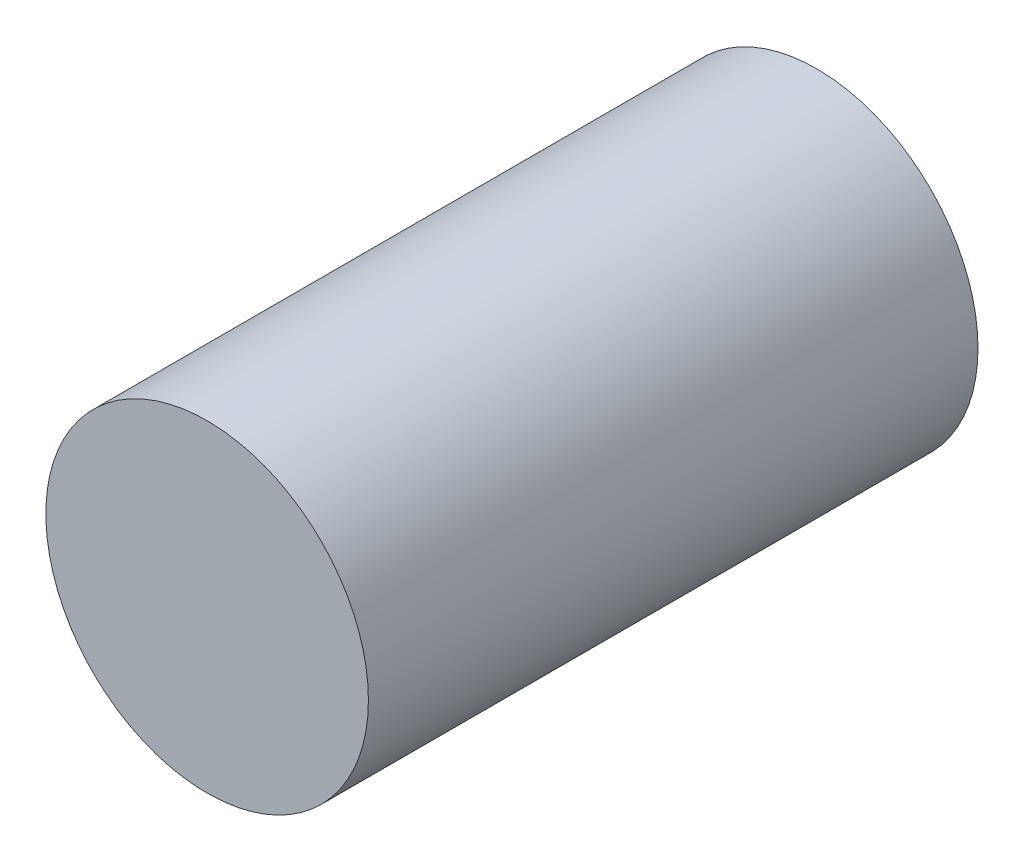
ISO-10303-21;
HEADER;
FILE_DESCRIPTION(('STEP AP214'),'2;1');
FILE_NAME('part.step','',(''),(''),'','','');
FILE_SCHEMA(('AUTOMOTIVE_DESIGN { 1 0 10303 214 1 1 1 1 }'));
ENDSEC;
DATA;
#1=APPLICATION_CONTEXT('core data for automotive mechanical design processes');
#2=APPLICATION_PROTOCOL_DEFINITION('international standard','automotive_design',2000,#1);
#3=PRODUCT_CONTEXT('',#1,'mechanical');
#4=PRODUCT('Part','Part','',(#3));
#5=PRODUCT_RELATED_PRODUCT_CATEGORY('part','',(#4));
#6=PRODUCT_DEFINITION_FORMATION('','',#4);
#7=PRODUCT_DEFINITION_CONTEXT('part definition',#1,'design');
#8=PRODUCT_DEFINITION('design','',#6,#7);
#9=PRODUCT_DEFINITION_SHAPE('','',#8);
#10=(LENGTH_UNIT() NAMED_UNIT(*) SI_UNIT(.MILLI.,.METRE.));
#11=(NAMED_UNIT(*) PLANE_ANGLE_UNIT() SI_UNIT($,.RADIAN.));
#12=(NAMED_UNIT(*) SI_UNIT($,.STERADIAN.) SOLID_ANGLE_UNIT());
#13=UNCERTAINTY_MEASURE_WITH_UNIT(LENGTH_MEASURE(1.E-05),#10,'distance_accuracy_value','');
#14=(GEOMETRIC_REPRESENTATION_CONTEXT(3) GLOBAL_UNCERTAINTY_ASSIGNED_CONTEXT((#13)) GLOBAL_UNIT_ASSIGNED_CONTEXT((#10,
#11,#12)) REPRESENTATION_CONTEXT('',''));
#15=CARTESIAN_POINT('',(0.,0.,0.));
#16=DIRECTION('',(0.,0.,1.));
#17=DIRECTION('',(1.,0.,0.));
#18=AXIS2_PLACEMENT_3D('',#15,#16,#17);
#19=CARTESIAN_POINT('',(0.,0.,12.));
#20=DIRECTION('',(0.,0.,-1.));
#21=DIRECTION('',(-1.,0.,0.));
#22=AXIS2_PLACEMENT_3D('',#19,#20,#21);
#23=CYLINDRICAL_SURFACE('',#22,3.175);
#24=CARTESIAN_POINT('',(0.,0.,12.));
#25=DIRECTION('',(0.,0.,1.));
#26=DIRECTION('',(1.,0.,0.));
#27=AXIS2_PLACEMENT_3D('',#24,#25,#26);
#28=CIRCLE('',#27,3.175);
#29=CARTESIAN_POINT('',(3.175,0.,12.));
#30=VERTEX_POINT('',#29);
#31=EDGE_CURVE('E10',#30,#30,#28,.T.);
#32=ORIENTED_EDGE('',*,*,#31,.F.);
#33=EDGE_LOOP('',(#32));
#34=FACE_BOUND('',#33,.T.);
#35=CARTESIAN_POINT('',(0.,0.,0.));
#36=DIRECTION('',(0.,0.,1.));
#37=DIRECTION('',(1.,0.,0.));
#38=AXIS2_PLACEMENT_3D('',#35,#36,#37);
#39=CIRCLE('',#38,3.175);
#40=CARTESIAN_POINT('',(3.175,0.,0.));
#41=VERTEX_POINT('',#40);
#42=EDGE_CURVE('E34',#41,#41,#39,.T.);
#43=ORIENTED_EDGE('',*,*,#42,.T.);
#44=EDGE_LOOP('',(#43));
#45=FACE_BOUND('',#44,.T.);
#46=ADVANCED_FACE('F31',(#34,#45),#23,.T.);
#47=CARTESIAN_POINT('',(0.,0.,12.));
#48=DIRECTION('',(0.,0.,1.));
#49=DIRECTION('',(1.,0.,0.));
#50=AXIS2_PLACEMENT_3D('',#47,#48,#49);
#51=PLANE('',#50);
#52=ORIENTED_EDGE('',*,*,#31,.T.);
#53=EDGE_LOOP('',(#52));
#54=FACE_BOUND('',#53,.T.);
#55=ADVANCED_FACE('F46',(#54),#51,.T.);
#56=CARTESIAN_POINT('',(0.,0.,0.));
#57=DIRECTION('',(0.,0.,1.));
#58=DIRECTION('',(1.,0.,0.));
#59=AXIS2_PLACEMENT_3D('',#56,#57,#58);
#60=PLANE('',#59);
#61=ORIENTED_EDGE('',*,*,#42,.F.);
#62=EDGE_LOOP('',(#61));
#63=FACE_BOUND('',#62,.T.);
#64=ADVANCED_FACE('F44',(#63),#60,.F.);
#65=CLOSED_SHELL('',(#46,#55,#64));
#66=MANIFOLD_SOLID_BREP('B2',#65);
#67=ADVANCED_BREP_SHAPE_REPRESENTATION('',(#18,#66),#14);
#68=SHAPE_DEFINITION_REPRESENTATION(#9,#67);
ENDSEC;
END-ISO-10303-21;
